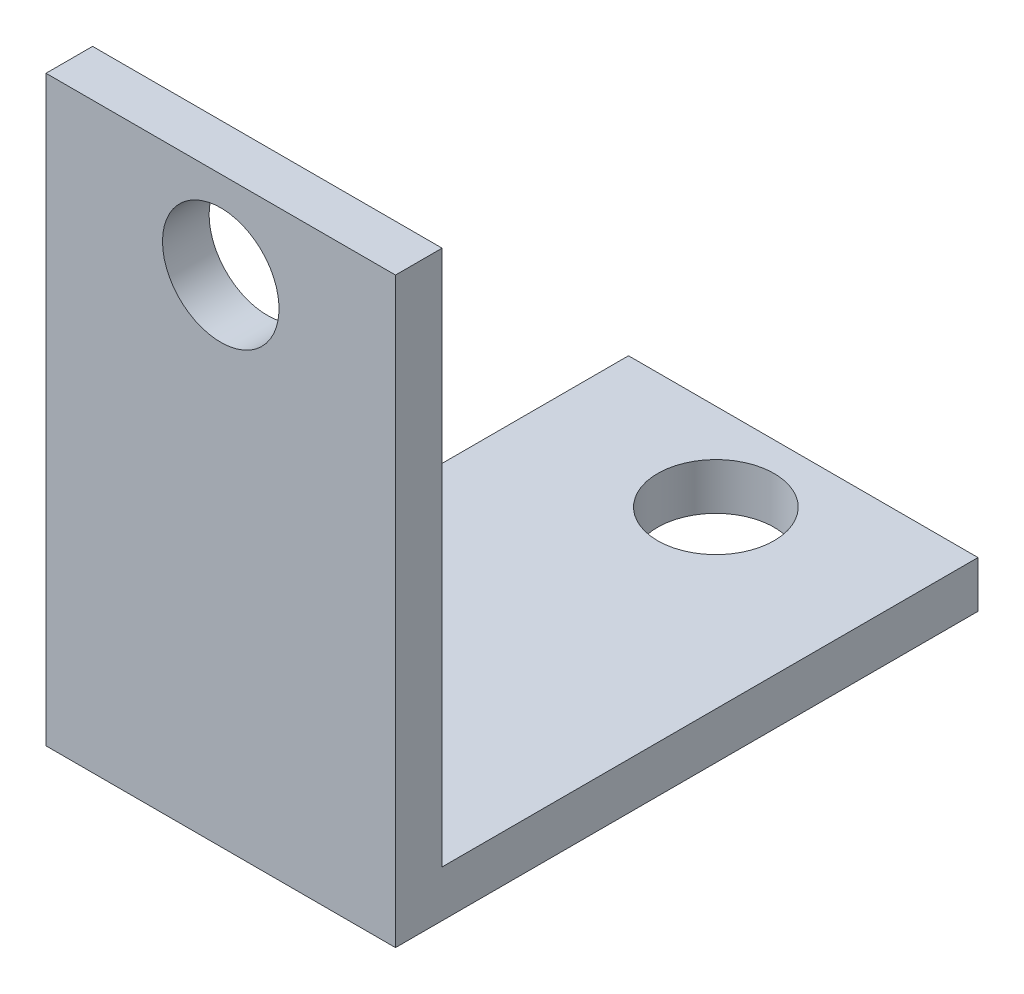
ISO-10303-21;
HEADER;
FILE_DESCRIPTION(('STEP AP214'),'2;1');
FILE_NAME('part.step','',(''),(''),'','','');
FILE_SCHEMA(('AUTOMOTIVE_DESIGN { 1 0 10303 214 1 1 1 1 }'));
ENDSEC;
DATA;
#1=APPLICATION_CONTEXT('core data for automotive mechanical design processes');
#2=APPLICATION_PROTOCOL_DEFINITION('international standard','automotive_design',2000,#1);
#3=PRODUCT_CONTEXT('',#1,'mechanical');
#4=PRODUCT('Part','Part','',(#3));
#5=PRODUCT_RELATED_PRODUCT_CATEGORY('part','',(#4));
#6=PRODUCT_DEFINITION_FORMATION('','',#4);
#7=PRODUCT_DEFINITION_CONTEXT('part definition',#1,'design');
#8=PRODUCT_DEFINITION('design','',#6,#7);
#9=PRODUCT_DEFINITION_SHAPE('','',#8);
#10=(LENGTH_UNIT() NAMED_UNIT(*) SI_UNIT(.MILLI.,.METRE.));
#11=(NAMED_UNIT(*) PLANE_ANGLE_UNIT() SI_UNIT($,.RADIAN.));
#12=(NAMED_UNIT(*) SI_UNIT($,.STERADIAN.) SOLID_ANGLE_UNIT());
#13=UNCERTAINTY_MEASURE_WITH_UNIT(LENGTH_MEASURE(1.E-05),#10,'distance_accuracy_value','');
#14=(GEOMETRIC_REPRESENTATION_CONTEXT(3) GLOBAL_UNCERTAINTY_ASSIGNED_CONTEXT((#13)) GLOBAL_UNIT_ASSIGNED_CONTEXT((#10,
#11,#12)) REPRESENTATION_CONTEXT('',''));
#15=CARTESIAN_POINT('',(0.,0.,0.));
#16=DIRECTION('',(0.,0.,1.));
#17=DIRECTION('',(1.,0.,0.));
#18=AXIS2_PLACEMENT_3D('',#15,#16,#17);
#19=CARTESIAN_POINT('',(0.,2.,0.));
#20=DIRECTION('',(0.,-1.,0.));
#21=DIRECTION('',(0.,0.,-1.));
#22=AXIS2_PLACEMENT_3D('',#19,#20,#21);
#23=PLANE('',#22);
#24=CARTESIAN_POINT('',(0.,2.,-8.75));
#25=DIRECTION('',(0.,1.,0.));
#26=DIRECTION('',(0.,0.,1.));
#27=AXIS2_PLACEMENT_3D('',#24,#25,#26);
#28=CIRCLE('',#27,2.5);
#29=CARTESIAN_POINT('',(0.,2.,-6.25));
#30=VERTEX_POINT('',#29);
#31=EDGE_CURVE('E99',#30,#30,#28,.T.);
#32=ORIENTED_EDGE('',*,*,#31,.F.);
#33=EDGE_LOOP('',(#32));
#34=FACE_BOUND('',#33,.T.);
#35=DIRECTION('',(-1.,0.,0.));
#36=VECTOR('',#35,1.);
#37=CARTESIAN_POINT('',(-7.5,2.,10.5));
#38=LINE('',#37,#36);
#39=CARTESIAN_POINT('',(7.5,2.,10.5));
#40=VERTEX_POINT('',#39);
#41=CARTESIAN_POINT('',(-7.5,2.,10.5));
#42=VERTEX_POINT('',#41);
#43=EDGE_CURVE('E52',#40,#42,#38,.T.);
#44=ORIENTED_EDGE('',*,*,#43,.F.);
#45=DIRECTION('',(0.,0.,-1.));
#46=VECTOR('',#45,1.);
#47=CARTESIAN_POINT('',(7.5,2.,12.5));
#48=LINE('',#47,#46);
#49=CARTESIAN_POINT('',(7.5,2.,-12.5));
#50=VERTEX_POINT('',#49);
#51=EDGE_CURVE('E148',#40,#50,#48,.T.);
#52=ORIENTED_EDGE('',*,*,#51,.T.);
#53=DIRECTION('',(-1.,0.,0.));
#54=VECTOR('',#53,1.);
#55=CARTESIAN_POINT('',(-7.5,2.,-12.5));
#56=LINE('',#55,#54);
#57=CARTESIAN_POINT('',(-7.5,2.,-12.5));
#58=VERTEX_POINT('',#57);
#59=EDGE_CURVE('E58',#50,#58,#56,.T.);
#60=ORIENTED_EDGE('',*,*,#59,.T.);
#61=DIRECTION('',(0.,0.,1.));
#62=VECTOR('',#61,1.);
#63=CARTESIAN_POINT('',(-7.5,2.,12.5));
#64=LINE('',#63,#62);
#65=EDGE_CURVE('E87',#58,#42,#64,.T.);
#66=ORIENTED_EDGE('',*,*,#65,.T.);
#67=EDGE_LOOP('',(#44,#52,#60,#66));
#68=FACE_BOUND('',#67,.T.);
#69=ADVANCED_FACE('F37',(#34,#68),#23,.F.);
#70=CARTESIAN_POINT('',(0.,0.,0.));
#71=DIRECTION('',(0.,-1.,0.));
#72=DIRECTION('',(0.,0.,-1.));
#73=AXIS2_PLACEMENT_3D('',#70,#71,#72);
#74=PLANE('',#73);
#75=DIRECTION('',(0.,0.,1.));
#76=VECTOR('',#75,1.);
#77=CARTESIAN_POINT('',(-7.5,0.,12.5));
#78=LINE('',#77,#76);
#79=CARTESIAN_POINT('',(-7.5,0.,-12.5));
#80=VERTEX_POINT('',#79);
#81=CARTESIAN_POINT('',(-7.5,0.,12.5));
#82=VERTEX_POINT('',#81);
#83=EDGE_CURVE('E93',#80,#82,#78,.T.);
#84=ORIENTED_EDGE('',*,*,#83,.F.);
#85=DIRECTION('',(-1.,0.,0.));
#86=VECTOR('',#85,1.);
#87=CARTESIAN_POINT('',(-7.5,0.,-12.5));
#88=LINE('',#87,#86);
#89=CARTESIAN_POINT('',(7.5,0.,-12.5));
#90=VERTEX_POINT('',#89);
#91=EDGE_CURVE('E77',#90,#80,#88,.T.);
#92=ORIENTED_EDGE('',*,*,#91,.F.);
#93=DIRECTION('',(0.,0.,-1.));
#94=VECTOR('',#93,1.);
#95=CARTESIAN_POINT('',(7.5,0.,12.5));
#96=LINE('',#95,#94);
#97=CARTESIAN_POINT('',(7.5,0.,12.5));
#98=VERTEX_POINT('',#97);
#99=EDGE_CURVE('E88',#98,#90,#96,.T.);
#100=ORIENTED_EDGE('',*,*,#99,.F.);
#101=DIRECTION('',(1.,0.,0.));
#102=VECTOR('',#101,1.);
#103=CARTESIAN_POINT('',(-7.5,0.,12.5));
#104=LINE('',#103,#102);
#105=EDGE_CURVE('E98',#82,#98,#104,.T.);
#106=ORIENTED_EDGE('',*,*,#105,.F.);
#107=EDGE_LOOP('',(#84,#92,#100,#106));
#108=FACE_BOUND('',#107,.T.);
#109=CARTESIAN_POINT('',(0.,0.,-8.75));
#110=DIRECTION('',(0.,1.,0.));
#111=DIRECTION('',(0.,0.,1.));
#112=AXIS2_PLACEMENT_3D('',#109,#110,#111);
#113=CIRCLE('',#112,2.5);
#114=CARTESIAN_POINT('',(0.,0.,-6.25));
#115=VERTEX_POINT('',#114);
#116=EDGE_CURVE('E103',#115,#115,#113,.T.);
#117=ORIENTED_EDGE('',*,*,#116,.T.);
#118=EDGE_LOOP('',(#117));
#119=FACE_BOUND('',#118,.T.);
#120=ADVANCED_FACE('F96',(#108,#119),#74,.T.);
#121=CARTESIAN_POINT('',(-7.5,2.,12.5));
#122=DIRECTION('',(1.,0.,0.));
#123=DIRECTION('',(0.,0.,-1.));
#124=AXIS2_PLACEMENT_3D('',#121,#122,#123);
#125=PLANE('',#124);
#126=ORIENTED_EDGE('',*,*,#83,.T.);
#127=DIRECTION('',(0.,-1.,0.));
#128=VECTOR('',#127,1.);
#129=CARTESIAN_POINT('',(-7.5,2.,12.5));
#130=LINE('',#129,#128);
#131=CARTESIAN_POINT('',(-7.5,25.,12.5));
#132=VERTEX_POINT('',#131);
#133=EDGE_CURVE('E11',#132,#82,#130,.T.);
#134=ORIENTED_EDGE('',*,*,#133,.F.);
#135=DIRECTION('',(0.,0.,1.));
#136=VECTOR('',#135,1.);
#137=CARTESIAN_POINT('',(-7.5,25.,12.5));
#138=LINE('',#137,#136);
#139=CARTESIAN_POINT('',(-7.5,25.,10.5));
#140=VERTEX_POINT('',#139);
#141=EDGE_CURVE('E131',#140,#132,#138,.T.);
#142=ORIENTED_EDGE('',*,*,#141,.F.);
#143=DIRECTION('',(0.,-1.,0.));
#144=VECTOR('',#143,1.);
#145=CARTESIAN_POINT('',(-7.5,25.,10.5));
#146=LINE('',#145,#144);
#147=EDGE_CURVE('E139',#140,#42,#146,.T.);
#148=ORIENTED_EDGE('',*,*,#147,.T.);
#149=ORIENTED_EDGE('',*,*,#65,.F.);
#150=DIRECTION('',(0.,-1.,0.));
#151=VECTOR('',#150,1.);
#152=CARTESIAN_POINT('',(-7.5,2.,-12.5));
#153=LINE('',#152,#151);
#154=EDGE_CURVE('E80',#58,#80,#153,.T.);
#155=ORIENTED_EDGE('',*,*,#154,.T.);
#156=EDGE_LOOP('',(#126,#134,#142,#148,#149,#155));
#157=FACE_BOUND('',#156,.T.);
#158=ADVANCED_FACE('F39',(#157),#125,.F.);
#159=CARTESIAN_POINT('',(-7.5,2.,12.5));
#160=DIRECTION('',(0.,0.,-1.));
#161=DIRECTION('',(-1.,0.,0.));
#162=AXIS2_PLACEMENT_3D('',#159,#160,#161);
#163=PLANE('',#162);
#164=CARTESIAN_POINT('',(0.,21.25,12.5));
#165=DIRECTION('',(0.,0.,-1.));
#166=DIRECTION('',(-1.,0.,0.));
#167=AXIS2_PLACEMENT_3D('',#164,#165,#166);
#168=CIRCLE('',#167,2.5);
#169=CARTESIAN_POINT('',(-2.5,21.25,12.5));
#170=VERTEX_POINT('',#169);
#171=EDGE_CURVE('E141',#170,#170,#168,.T.);
#172=ORIENTED_EDGE('',*,*,#171,.T.);
#173=EDGE_LOOP('',(#172));
#174=FACE_BOUND('',#173,.T.);
#175=ORIENTED_EDGE('',*,*,#105,.T.);
#176=DIRECTION('',(0.,-1.,0.));
#177=VECTOR('',#176,1.);
#178=CARTESIAN_POINT('',(7.5,2.,12.5));
#179=LINE('',#178,#177);
#180=CARTESIAN_POINT('',(7.5,25.,12.5));
#181=VERTEX_POINT('',#180);
#182=EDGE_CURVE('E45',#181,#98,#179,.T.);
#183=ORIENTED_EDGE('',*,*,#182,.F.);
#184=DIRECTION('',(1.,0.,0.));
#185=VECTOR('',#184,1.);
#186=CARTESIAN_POINT('',(-7.5,25.,12.5));
#187=LINE('',#186,#185);
#188=EDGE_CURVE('E123',#132,#181,#187,.T.);
#189=ORIENTED_EDGE('',*,*,#188,.F.);
#190=ORIENTED_EDGE('',*,*,#133,.T.);
#191=EDGE_LOOP('',(#175,#183,#189,#190));
#192=FACE_BOUND('',#191,.T.);
#193=ADVANCED_FACE('F121',(#174,#192),#163,.F.);
#194=CARTESIAN_POINT('',(7.5,2.,12.5));
#195=DIRECTION('',(-1.,0.,0.));
#196=DIRECTION('',(0.,0.,1.));
#197=AXIS2_PLACEMENT_3D('',#194,#195,#196);
#198=PLANE('',#197);
#199=ORIENTED_EDGE('',*,*,#99,.T.);
#200=DIRECTION('',(0.,-1.,0.));
#201=VECTOR('',#200,1.);
#202=CARTESIAN_POINT('',(7.5,2.,-12.5));
#203=LINE('',#202,#201);
#204=EDGE_CURVE('E83',#50,#90,#203,.T.);
#205=ORIENTED_EDGE('',*,*,#204,.F.);
#206=ORIENTED_EDGE('',*,*,#51,.F.);
#207=DIRECTION('',(0.,-1.,0.));
#208=VECTOR('',#207,1.);
#209=CARTESIAN_POINT('',(7.5,25.,10.5));
#210=LINE('',#209,#208);
#211=CARTESIAN_POINT('',(7.5,25.,10.5));
#212=VERTEX_POINT('',#211);
#213=EDGE_CURVE('E143',#212,#40,#210,.T.);
#214=ORIENTED_EDGE('',*,*,#213,.F.);
#215=DIRECTION('',(0.,0.,-1.));
#216=VECTOR('',#215,1.);
#217=CARTESIAN_POINT('',(7.5,25.,12.5));
#218=LINE('',#217,#216);
#219=EDGE_CURVE('E117',#181,#212,#218,.T.);
#220=ORIENTED_EDGE('',*,*,#219,.F.);
#221=ORIENTED_EDGE('',*,*,#182,.T.);
#222=EDGE_LOOP('',(#199,#205,#206,#214,#220,#221));
#223=FACE_BOUND('',#222,.T.);
#224=ADVANCED_FACE('F113',(#223),#198,.F.);
#225=CARTESIAN_POINT('',(-7.5,2.,-12.5));
#226=DIRECTION('',(0.,0.,1.));
#227=DIRECTION('',(1.,0.,0.));
#228=AXIS2_PLACEMENT_3D('',#225,#226,#227);
#229=PLANE('',#228);
#230=ORIENTED_EDGE('',*,*,#91,.T.);
#231=ORIENTED_EDGE('',*,*,#154,.F.);
#232=ORIENTED_EDGE('',*,*,#59,.F.);
#233=ORIENTED_EDGE('',*,*,#204,.T.);
#234=EDGE_LOOP('',(#230,#231,#232,#233));
#235=FACE_BOUND('',#234,.T.);
#236=ADVANCED_FACE('F79',(#235),#229,.F.);
#237=CARTESIAN_POINT('',(0.,2.,-8.75));
#238=DIRECTION('',(0.,-1.,0.));
#239=DIRECTION('',(0.,0.,-1.));
#240=AXIS2_PLACEMENT_3D('',#237,#238,#239);
#241=CYLINDRICAL_SURFACE('',#240,2.5);
#242=ORIENTED_EDGE('',*,*,#31,.T.);
#243=EDGE_LOOP('',(#242));
#244=FACE_BOUND('',#243,.T.);
#245=ORIENTED_EDGE('',*,*,#116,.F.);
#246=EDGE_LOOP('',(#245));
#247=FACE_BOUND('',#246,.T.);
#248=ADVANCED_FACE('F158',(#244,#247),#241,.F.);
#249=CARTESIAN_POINT('',(-7.5,25.,10.5));
#250=DIRECTION('',(0.,0.,1.));
#251=DIRECTION('',(1.,0.,0.));
#252=AXIS2_PLACEMENT_3D('',#249,#250,#251);
#253=PLANE('',#252);
#254=CARTESIAN_POINT('',(0.,21.25,10.5));
#255=DIRECTION('',(0.,0.,-1.));
#256=DIRECTION('',(-1.,0.,0.));
#257=AXIS2_PLACEMENT_3D('',#254,#255,#256);
#258=CIRCLE('',#257,2.5);
#259=CARTESIAN_POINT('',(-2.5,21.25,10.5));
#260=VERTEX_POINT('',#259);
#261=EDGE_CURVE('E190',#260,#260,#258,.T.);
#262=ORIENTED_EDGE('',*,*,#261,.F.);
#263=EDGE_LOOP('',(#262));
#264=FACE_BOUND('',#263,.T.);
#265=ORIENTED_EDGE('',*,*,#43,.T.);
#266=ORIENTED_EDGE('',*,*,#147,.F.);
#267=DIRECTION('',(-1.,0.,0.));
#268=VECTOR('',#267,1.);
#269=CARTESIAN_POINT('',(-7.5,25.,10.5));
#270=LINE('',#269,#268);
#271=EDGE_CURVE('E133',#212,#140,#270,.T.);
#272=ORIENTED_EDGE('',*,*,#271,.F.);
#273=ORIENTED_EDGE('',*,*,#213,.T.);
#274=EDGE_LOOP('',(#265,#266,#272,#273));
#275=FACE_BOUND('',#274,.T.);
#276=ADVANCED_FACE('F151',(#264,#275),#253,.F.);
#277=CARTESIAN_POINT('',(0.,25.,0.));
#278=DIRECTION('',(0.,-1.,0.));
#279=DIRECTION('',(0.,0.,-1.));
#280=AXIS2_PLACEMENT_3D('',#277,#278,#279);
#281=PLANE('',#280);
#282=ORIENTED_EDGE('',*,*,#141,.T.);
#283=ORIENTED_EDGE('',*,*,#188,.T.);
#284=ORIENTED_EDGE('',*,*,#219,.T.);
#285=ORIENTED_EDGE('',*,*,#271,.T.);
#286=EDGE_LOOP('',(#282,#283,#284,#285));
#287=FACE_BOUND('',#286,.T.);
#288=ADVANCED_FACE('F128',(#287),#281,.F.);
#289=CARTESIAN_POINT('',(0.,21.25,23.5));
#290=DIRECTION('',(0.,0.,-1.));
#291=DIRECTION('',(-1.,0.,0.));
#292=AXIS2_PLACEMENT_3D('',#289,#290,#291);
#293=CYLINDRICAL_SURFACE('',#292,2.5);
#294=CARTESIAN_POINT('',(-2.5,21.25,10.5));
#295=CARTESIAN_POINT('',(-2.5,21.25,10.5208333333333));
#296=CARTESIAN_POINT('',(-2.5,21.25,10.5416666666667));
#297=CARTESIAN_POINT('',(-2.5,21.25,10.5833333333333));
#298=CARTESIAN_POINT('',(-2.5,21.25,10.6041666666667));
#299=CARTESIAN_POINT('',(-2.5,21.25,10.6458333333333));
#300=CARTESIAN_POINT('',(-2.5,21.25,10.6666666666667));
#301=CARTESIAN_POINT('',(-2.5,21.25,10.7083333333333));
#302=CARTESIAN_POINT('',(-2.5,21.25,10.7291666666667));
#303=CARTESIAN_POINT('',(-2.5,21.25,10.7708333333333));
#304=CARTESIAN_POINT('',(-2.5,21.25,10.7916666666667));
#305=CARTESIAN_POINT('',(-2.5,21.25,10.8333333333333));
#306=CARTESIAN_POINT('',(-2.5,21.25,10.8541666666667));
#307=CARTESIAN_POINT('',(-2.5,21.25,10.8958333333333));
#308=CARTESIAN_POINT('',(-2.5,21.25,10.9166666666667));
#309=CARTESIAN_POINT('',(-2.5,21.25,10.9583333333333));
#310=CARTESIAN_POINT('',(-2.5,21.25,10.9791666666667));
#311=CARTESIAN_POINT('',(-2.5,21.25,11.0208333333333));
#312=CARTESIAN_POINT('',(-2.5,21.25,11.0416666666667));
#313=CARTESIAN_POINT('',(-2.5,21.25,11.0833333333333));
#314=CARTESIAN_POINT('',(-2.5,21.25,11.1041666666667));
#315=CARTESIAN_POINT('',(-2.5,21.25,11.1458333333333));
#316=CARTESIAN_POINT('',(-2.5,21.25,11.1666666666667));
#317=CARTESIAN_POINT('',(-2.5,21.25,11.2083333333333));
#318=CARTESIAN_POINT('',(-2.5,21.25,11.2291666666667));
#319=CARTESIAN_POINT('',(-2.5,21.25,11.2708333333333));
#320=CARTESIAN_POINT('',(-2.5,21.25,11.2916666666667));
#321=CARTESIAN_POINT('',(-2.5,21.25,11.3333333333333));
#322=CARTESIAN_POINT('',(-2.5,21.25,11.3541666666667));
#323=CARTESIAN_POINT('',(-2.5,21.25,11.3958333333333));
#324=CARTESIAN_POINT('',(-2.5,21.25,11.4166666666667));
#325=CARTESIAN_POINT('',(-2.5,21.25,11.4583333333333));
#326=CARTESIAN_POINT('',(-2.5,21.25,11.4791666666667));
#327=CARTESIAN_POINT('',(-2.5,21.25,11.5208333333333));
#328=CARTESIAN_POINT('',(-2.5,21.25,11.5416666666667));
#329=CARTESIAN_POINT('',(-2.5,21.25,11.5833333333333));
#330=CARTESIAN_POINT('',(-2.5,21.25,11.6041666666667));
#331=CARTESIAN_POINT('',(-2.5,21.25,11.6458333333333));
#332=CARTESIAN_POINT('',(-2.5,21.25,11.6666666666667));
#333=CARTESIAN_POINT('',(-2.5,21.25,11.7083333333333));
#334=CARTESIAN_POINT('',(-2.5,21.25,11.7291666666667));
#335=CARTESIAN_POINT('',(-2.5,21.25,11.7708333333333));
#336=CARTESIAN_POINT('',(-2.5,21.25,11.7916666666667));
#337=CARTESIAN_POINT('',(-2.5,21.25,11.8333333333333));
#338=CARTESIAN_POINT('',(-2.5,21.25,11.8541666666667));
#339=CARTESIAN_POINT('',(-2.5,21.25,11.8958333333333));
#340=CARTESIAN_POINT('',(-2.5,21.25,11.9166666666667));
#341=CARTESIAN_POINT('',(-2.5,21.25,11.9583333333333));
#342=CARTESIAN_POINT('',(-2.5,21.25,11.9791666666667));
#343=CARTESIAN_POINT('',(-2.5,21.25,12.0208333333333));
#344=CARTESIAN_POINT('',(-2.5,21.25,12.0416666666667));
#345=CARTESIAN_POINT('',(-2.5,21.25,12.0833333333333));
#346=CARTESIAN_POINT('',(-2.5,21.25,12.1041666666667));
#347=CARTESIAN_POINT('',(-2.5,21.25,12.1458333333333));
#348=CARTESIAN_POINT('',(-2.5,21.25,12.1666666666667));
#349=CARTESIAN_POINT('',(-2.5,21.25,12.2083333333333));
#350=CARTESIAN_POINT('',(-2.5,21.25,12.2291666666667));
#351=CARTESIAN_POINT('',(-2.5,21.25,12.2708333333333));
#352=CARTESIAN_POINT('',(-2.5,21.25,12.2916666666667));
#353=CARTESIAN_POINT('',(-2.5,21.25,12.3333333333333));
#354=CARTESIAN_POINT('',(-2.5,21.25,12.3541666666667));
#355=CARTESIAN_POINT('',(-2.5,21.25,12.3958333333333));
#356=CARTESIAN_POINT('',(-2.5,21.25,12.4166666666667));
#357=CARTESIAN_POINT('',(-2.5,21.25,12.4583333333333));
#358=CARTESIAN_POINT('',(-2.5,21.25,12.4791666666667));
#359=CARTESIAN_POINT('',(-2.5,21.25,12.5));
#360=B_SPLINE_CURVE_WITH_KNOTS('',3,(#294,#295,#296,#297,#298,#299,#300,#301,#302,#303,#304,
#305,#306,#307,#308,#309,#310,#311,#312,#313,#314,#315,#316,#317,#318,#319,#320,#321,#322,#323,
#324,#325,#326,#327,#328,#329,#330,#331,#332,#333,#334,#335,#336,#337,#338,#339,#340,#341,#342,
#343,#344,#345,#346,#347,#348,#349,#350,#351,#352,#353,#354,#355,#356,#357,#358,#359),
.UNSPECIFIED.,.F.,.F.,(4,2,2,2,2,2,2,2,2,2,2,2,2,2,2,2,2,2,2,2,2,2,2,2,2,2,2,2,2,2,2,2,4),(0.,
0.0625000000000001,0.125,0.1875,0.25,0.3125,0.375,0.4375,0.5,0.5625,0.625000000000001,
0.687500000000001,0.750000000000001,0.812500000000001,0.875000000000001,0.937500000000001,1.,
1.0625,1.125,1.1875,1.25,1.3125,1.375,1.4375,1.5,1.5625,1.625,1.6875,1.75,1.8125,1.875,1.9375,
2.),.UNSPECIFIED.);
#361=EDGE_CURVE('BSEAM165',#260,#170,#360,.T.);
#362=ORIENTED_EDGE('',*,*,#261,.T.);
#363=ORIENTED_EDGE('',*,*,#171,.F.);
#364=ORIENTED_EDGE('',*,*,#361,.T.);
#365=ORIENTED_EDGE('',*,*,#361,.F.);
#366=EDGE_LOOP('',(#362,#364,#363,#365));
#367=FACE_BOUND('',#366,.T.);
#368=ADVANCED_FACE('F165',(#367),#293,.F.);
#369=CLOSED_SHELL('',(#69,#120,#158,#193,#224,#236,#248,#276,#288,#368));
#370=MANIFOLD_SOLID_BREP('B2',#369);
#371=ADVANCED_BREP_SHAPE_REPRESENTATION('',(#18,#370),#14);
#372=SHAPE_DEFINITION_REPRESENTATION(#9,#371);
ENDSEC;
END-ISO-10303-21;
